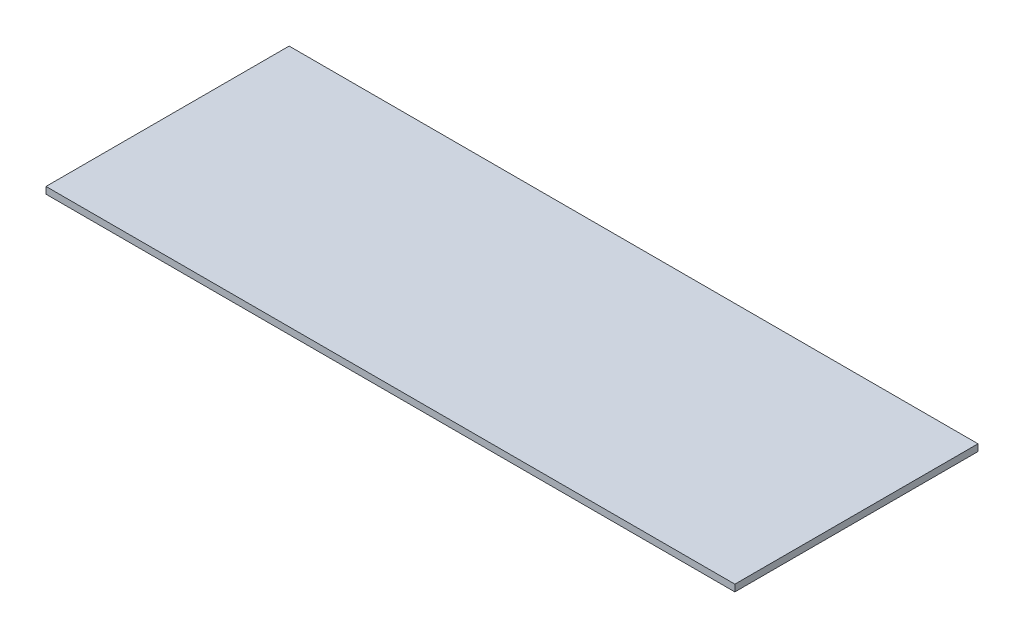
ISO-10303-21;
HEADER;
FILE_DESCRIPTION(('STEP AP214'),'2;1');
FILE_NAME('part.step','',(''),(''),'','','');
FILE_SCHEMA(('AUTOMOTIVE_DESIGN { 1 0 10303 214 1 1 1 1 }'));
ENDSEC;
DATA;
#1=APPLICATION_CONTEXT('core data for automotive mechanical design processes');
#2=APPLICATION_PROTOCOL_DEFINITION('international standard','automotive_design',2000,#1);
#3=PRODUCT_CONTEXT('',#1,'mechanical');
#4=PRODUCT('Part','Part','',(#3));
#5=PRODUCT_RELATED_PRODUCT_CATEGORY('part','',(#4));
#6=PRODUCT_DEFINITION_FORMATION('','',#4);
#7=PRODUCT_DEFINITION_CONTEXT('part definition',#1,'design');
#8=PRODUCT_DEFINITION('design','',#6,#7);
#9=PRODUCT_DEFINITION_SHAPE('','',#8);
#10=(LENGTH_UNIT() NAMED_UNIT(*) SI_UNIT(.MILLI.,.METRE.));
#11=(NAMED_UNIT(*) PLANE_ANGLE_UNIT() SI_UNIT($,.RADIAN.));
#12=(NAMED_UNIT(*) SI_UNIT($,.STERADIAN.) SOLID_ANGLE_UNIT());
#13=UNCERTAINTY_MEASURE_WITH_UNIT(LENGTH_MEASURE(1.E-05),#10,'distance_accuracy_value','');
#14=(GEOMETRIC_REPRESENTATION_CONTEXT(3) GLOBAL_UNCERTAINTY_ASSIGNED_CONTEXT((#13)) GLOBAL_UNIT_ASSIGNED_CONTEXT((#10,
#11,#12)) REPRESENTATION_CONTEXT('',''));
#15=CARTESIAN_POINT('',(0.,0.,0.));
#16=DIRECTION('',(0.,0.,1.));
#17=DIRECTION('',(1.,0.,0.));
#18=AXIS2_PLACEMENT_3D('',#15,#16,#17);
#19=CARTESIAN_POINT('',(323.85,6.35,114.3));
#20=DIRECTION('',(-1.,0.,0.));
#21=DIRECTION('',(0.,0.,1.));
#22=AXIS2_PLACEMENT_3D('',#19,#20,#21);
#23=PLANE('',#22);
#24=DIRECTION('',(0.,0.,-1.));
#25=VECTOR('',#24,1.);
#26=CARTESIAN_POINT('',(323.85,0.,114.3));
#27=LINE('',#26,#25);
#28=CARTESIAN_POINT('',(323.85,0.,114.3));
#29=VERTEX_POINT('',#28);
#30=CARTESIAN_POINT('',(323.85,0.,-114.3));
#31=VERTEX_POINT('',#30);
#32=EDGE_CURVE('E111',#29,#31,#27,.T.);
#33=ORIENTED_EDGE('',*,*,#32,.T.);
#34=DIRECTION('',(0.,-1.,0.));
#35=VECTOR('',#34,1.);
#36=CARTESIAN_POINT('',(323.85,6.35,-114.3));
#37=LINE('',#36,#35);
#38=CARTESIAN_POINT('',(323.85,6.35,-114.3));
#39=VERTEX_POINT('',#38);
#40=EDGE_CURVE('E11',#39,#31,#37,.T.);
#41=ORIENTED_EDGE('',*,*,#40,.F.);
#42=DIRECTION('',(0.,0.,-1.));
#43=VECTOR('',#42,1.);
#44=CARTESIAN_POINT('',(323.85,6.35,114.3));
#45=LINE('',#44,#43);
#46=CARTESIAN_POINT('',(323.85,6.35,114.3));
#47=VERTEX_POINT('',#46);
#48=EDGE_CURVE('E95',#47,#39,#45,.T.);
#49=ORIENTED_EDGE('',*,*,#48,.F.);
#50=DIRECTION('',(0.,-1.,0.));
#51=VECTOR('',#50,1.);
#52=CARTESIAN_POINT('',(323.85,6.35,114.3));
#53=LINE('',#52,#51);
#54=EDGE_CURVE('E107',#47,#29,#53,.T.);
#55=ORIENTED_EDGE('',*,*,#54,.T.);
#56=EDGE_LOOP('',(#33,#41,#49,#55));
#57=FACE_BOUND('',#56,.T.);
#58=ADVANCED_FACE('F43',(#57),#23,.F.);
#59=CARTESIAN_POINT('',(-323.85,6.35,-114.3));
#60=DIRECTION('',(0.,0.,1.));
#61=DIRECTION('',(1.,0.,0.));
#62=AXIS2_PLACEMENT_3D('',#59,#60,#61);
#63=PLANE('',#62);
#64=DIRECTION('',(-1.,0.,0.));
#65=VECTOR('',#64,1.);
#66=CARTESIAN_POINT('',(-323.85,0.,-114.3));
#67=LINE('',#66,#65);
#68=CARTESIAN_POINT('',(-323.85,0.,-114.3));
#69=VERTEX_POINT('',#68);
#70=EDGE_CURVE('E100',#31,#69,#67,.T.);
#71=ORIENTED_EDGE('',*,*,#70,.T.);
#72=DIRECTION('',(0.,-1.,0.));
#73=VECTOR('',#72,1.);
#74=CARTESIAN_POINT('',(-323.85,6.35,-114.3));
#75=LINE('',#74,#73);
#76=CARTESIAN_POINT('',(-323.85,6.35,-114.3));
#77=VERTEX_POINT('',#76);
#78=EDGE_CURVE('E52',#77,#69,#75,.T.);
#79=ORIENTED_EDGE('',*,*,#78,.F.);
#80=DIRECTION('',(-1.,0.,0.));
#81=VECTOR('',#80,1.);
#82=CARTESIAN_POINT('',(-323.85,6.35,-114.3));
#83=LINE('',#82,#81);
#84=EDGE_CURVE('E90',#39,#77,#83,.T.);
#85=ORIENTED_EDGE('',*,*,#84,.F.);
#86=ORIENTED_EDGE('',*,*,#40,.T.);
#87=EDGE_LOOP('',(#71,#79,#85,#86));
#88=FACE_BOUND('',#87,.T.);
#89=ADVANCED_FACE('F99',(#88),#63,.F.);
#90=CARTESIAN_POINT('',(-323.85,6.35,114.3));
#91=DIRECTION('',(1.,0.,0.));
#92=DIRECTION('',(0.,0.,-1.));
#93=AXIS2_PLACEMENT_3D('',#90,#91,#92);
#94=PLANE('',#93);
#95=DIRECTION('',(0.,0.,1.));
#96=VECTOR('',#95,1.);
#97=CARTESIAN_POINT('',(-323.85,0.,114.3));
#98=LINE('',#97,#96);
#99=CARTESIAN_POINT('',(-323.85,0.,114.3));
#100=VERTEX_POINT('',#99);
#101=EDGE_CURVE('E77',#69,#100,#98,.T.);
#102=ORIENTED_EDGE('',*,*,#101,.T.);
#103=DIRECTION('',(0.,-1.,0.));
#104=VECTOR('',#103,1.);
#105=CARTESIAN_POINT('',(-323.85,6.35,114.3));
#106=LINE('',#105,#104);
#107=CARTESIAN_POINT('',(-323.85,6.35,114.3));
#108=VERTEX_POINT('',#107);
#109=EDGE_CURVE('E102',#108,#100,#106,.T.);
#110=ORIENTED_EDGE('',*,*,#109,.F.);
#111=DIRECTION('',(0.,0.,1.));
#112=VECTOR('',#111,1.);
#113=CARTESIAN_POINT('',(-323.85,6.35,114.3));
#114=LINE('',#113,#112);
#115=EDGE_CURVE('E93',#77,#108,#114,.T.);
#116=ORIENTED_EDGE('',*,*,#115,.F.);
#117=ORIENTED_EDGE('',*,*,#78,.T.);
#118=EDGE_LOOP('',(#102,#110,#116,#117));
#119=FACE_BOUND('',#118,.T.);
#120=ADVANCED_FACE('F103',(#119),#94,.F.);
#121=CARTESIAN_POINT('',(-323.85,6.35,114.3));
#122=DIRECTION('',(0.,0.,-1.));
#123=DIRECTION('',(-1.,0.,0.));
#124=AXIS2_PLACEMENT_3D('',#121,#122,#123);
#125=PLANE('',#124);
#126=DIRECTION('',(1.,0.,0.));
#127=VECTOR('',#126,1.);
#128=CARTESIAN_POINT('',(-323.85,0.,114.3));
#129=LINE('',#128,#127);
#130=EDGE_CURVE('E83',#100,#29,#129,.T.);
#131=ORIENTED_EDGE('',*,*,#130,.T.);
#132=ORIENTED_EDGE('',*,*,#54,.F.);
#133=DIRECTION('',(1.,0.,0.));
#134=VECTOR('',#133,1.);
#135=CARTESIAN_POINT('',(-323.85,6.35,114.3));
#136=LINE('',#135,#134);
#137=EDGE_CURVE('E60',#108,#47,#136,.T.);
#138=ORIENTED_EDGE('',*,*,#137,.F.);
#139=ORIENTED_EDGE('',*,*,#109,.T.);
#140=EDGE_LOOP('',(#131,#132,#138,#139));
#141=FACE_BOUND('',#140,.T.);
#142=ADVANCED_FACE('F124',(#141),#125,.F.);
#143=CARTESIAN_POINT('',(0.,6.35,0.));
#144=DIRECTION('',(0.,-1.,0.));
#145=DIRECTION('',(0.,0.,-1.));
#146=AXIS2_PLACEMENT_3D('',#143,#144,#145);
#147=PLANE('',#146);
#148=ORIENTED_EDGE('',*,*,#48,.T.);
#149=ORIENTED_EDGE('',*,*,#84,.T.);
#150=ORIENTED_EDGE('',*,*,#115,.T.);
#151=ORIENTED_EDGE('',*,*,#137,.T.);
#152=EDGE_LOOP('',(#148,#149,#150,#151));
#153=FACE_BOUND('',#152,.T.);
#154=ADVANCED_FACE('F91',(#153),#147,.F.);
#155=CARTESIAN_POINT('',(0.,0.,0.));
#156=DIRECTION('',(0.,-1.,0.));
#157=DIRECTION('',(0.,0.,-1.));
#158=AXIS2_PLACEMENT_3D('',#155,#156,#157);
#159=PLANE('',#158);
#160=ORIENTED_EDGE('',*,*,#32,.F.);
#161=ORIENTED_EDGE('',*,*,#130,.F.);
#162=ORIENTED_EDGE('',*,*,#101,.F.);
#163=ORIENTED_EDGE('',*,*,#70,.F.);
#164=EDGE_LOOP('',(#160,#161,#162,#163));
#165=FACE_BOUND('',#164,.T.);
#166=ADVANCED_FACE('F127',(#165),#159,.T.);
#167=CLOSED_SHELL('',(#58,#89,#120,#142,#154,#166));
#168=MANIFOLD_SOLID_BREP('B2',#167);
#169=ADVANCED_BREP_SHAPE_REPRESENTATION('',(#18,#168),#14);
#170=SHAPE_DEFINITION_REPRESENTATION(#9,#169);
ENDSEC;
END-ISO-10303-21;
